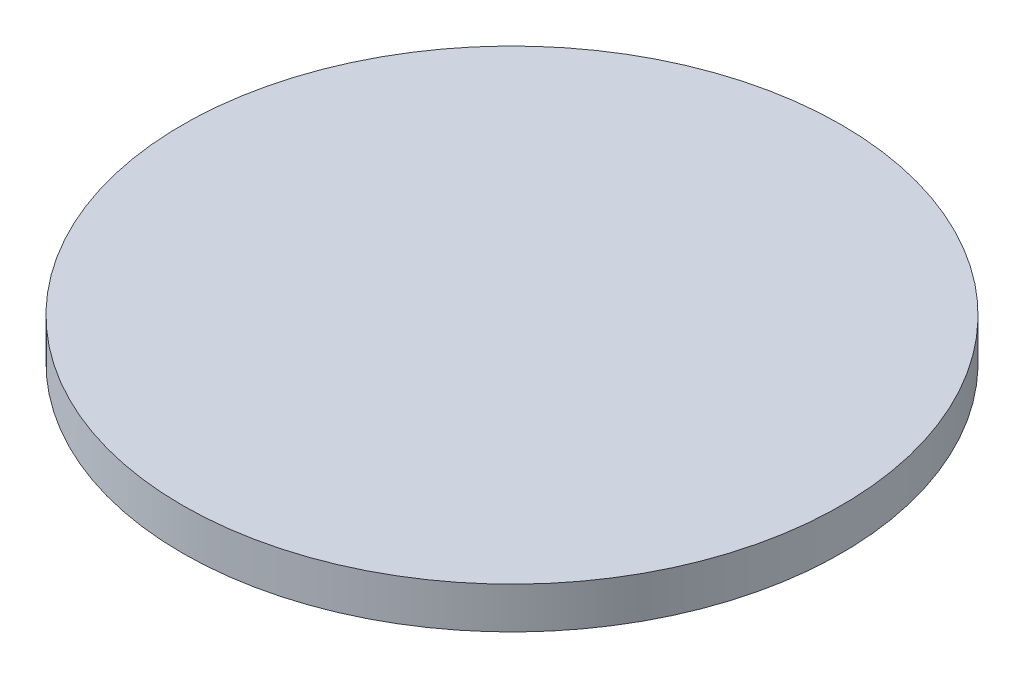
ISO-10303-21;
HEADER;
FILE_DESCRIPTION(('STEP AP214'),'2;1');
FILE_NAME('part.step','',(''),(''),'','','');
FILE_SCHEMA(('AUTOMOTIVE_DESIGN { 1 0 10303 214 1 1 1 1 }'));
ENDSEC;
DATA;
#1=APPLICATION_CONTEXT('core data for automotive mechanical design processes');
#2=APPLICATION_PROTOCOL_DEFINITION('international standard','automotive_design',2000,#1);
#3=PRODUCT_CONTEXT('',#1,'mechanical');
#4=PRODUCT('Part','Part','',(#3));
#5=PRODUCT_RELATED_PRODUCT_CATEGORY('part','',(#4));
#6=PRODUCT_DEFINITION_FORMATION('','',#4);
#7=PRODUCT_DEFINITION_CONTEXT('part definition',#1,'design');
#8=PRODUCT_DEFINITION('design','',#6,#7);
#9=PRODUCT_DEFINITION_SHAPE('','',#8);
#10=(LENGTH_UNIT() NAMED_UNIT(*) SI_UNIT(.MILLI.,.METRE.));
#11=(NAMED_UNIT(*) PLANE_ANGLE_UNIT() SI_UNIT($,.RADIAN.));
#12=(NAMED_UNIT(*) SI_UNIT($,.STERADIAN.) SOLID_ANGLE_UNIT());
#13=UNCERTAINTY_MEASURE_WITH_UNIT(LENGTH_MEASURE(1.E-05),#10,'distance_accuracy_value','');
#14=(GEOMETRIC_REPRESENTATION_CONTEXT(3) GLOBAL_UNCERTAINTY_ASSIGNED_CONTEXT((#13)) GLOBAL_UNIT_ASSIGNED_CONTEXT((#10,
#11,#12)) REPRESENTATION_CONTEXT('',''));
#15=CARTESIAN_POINT('',(0.,0.,0.));
#16=DIRECTION('',(0.,0.,1.));
#17=DIRECTION('',(1.,0.,0.));
#18=AXIS2_PLACEMENT_3D('',#15,#16,#17);
#19=CARTESIAN_POINT('',(0.,2.54,0.));
#20=DIRECTION('',(0.,-1.,0.));
#21=DIRECTION('',(0.,0.,-1.));
#22=AXIS2_PLACEMENT_3D('',#19,#20,#21);
#23=CYLINDRICAL_SURFACE('',#22,20.2176172101462);
#24=CARTESIAN_POINT('',(0.,2.54,0.));
#25=DIRECTION('',(0.,1.,0.));
#26=DIRECTION('',(0.,0.,1.));
#27=AXIS2_PLACEMENT_3D('',#24,#25,#26);
#28=CIRCLE('',#27,20.2176172101462);
#29=CARTESIAN_POINT('',(0.,2.54,20.2176172101462));
#30=VERTEX_POINT('',#29);
#31=EDGE_CURVE('E10',#30,#30,#28,.T.);
#32=ORIENTED_EDGE('',*,*,#31,.F.);
#33=EDGE_LOOP('',(#32));
#34=FACE_BOUND('',#33,.T.);
#35=CARTESIAN_POINT('',(0.,0.,0.));
#36=DIRECTION('',(0.,1.,0.));
#37=DIRECTION('',(0.,0.,1.));
#38=AXIS2_PLACEMENT_3D('',#35,#36,#37);
#39=CIRCLE('',#38,20.2176172101462);
#40=CARTESIAN_POINT('',(0.,0.,20.2176172101462));
#41=VERTEX_POINT('',#40);
#42=EDGE_CURVE('E40',#41,#41,#39,.T.);
#43=ORIENTED_EDGE('',*,*,#42,.T.);
#44=EDGE_LOOP('',(#43));
#45=FACE_BOUND('',#44,.T.);
#46=ADVANCED_FACE('F37',(#34,#45),#23,.T.);
#47=CARTESIAN_POINT('',(0.,2.54,0.));
#48=DIRECTION('',(0.,1.,0.));
#49=DIRECTION('',(0.,0.,1.));
#50=AXIS2_PLACEMENT_3D('',#47,#48,#49);
#51=PLANE('',#50);
#52=ORIENTED_EDGE('',*,*,#31,.T.);
#53=EDGE_LOOP('',(#52));
#54=FACE_BOUND('',#53,.T.);
#55=ADVANCED_FACE('F52',(#54),#51,.T.);
#56=CARTESIAN_POINT('',(0.,0.,0.));
#57=DIRECTION('',(0.,1.,0.));
#58=DIRECTION('',(0.,0.,1.));
#59=AXIS2_PLACEMENT_3D('',#56,#57,#58);
#60=PLANE('',#59);
#61=ORIENTED_EDGE('',*,*,#42,.F.);
#62=EDGE_LOOP('',(#61));
#63=FACE_BOUND('',#62,.T.);
#64=ADVANCED_FACE('F50',(#63),#60,.F.);
#65=CLOSED_SHELL('',(#46,#55,#64));
#66=MANIFOLD_SOLID_BREP('B2',#65);
#67=ADVANCED_BREP_SHAPE_REPRESENTATION('',(#18,#66),#14);
#68=SHAPE_DEFINITION_REPRESENTATION(#9,#67);
ENDSEC;
END-ISO-10303-21;
